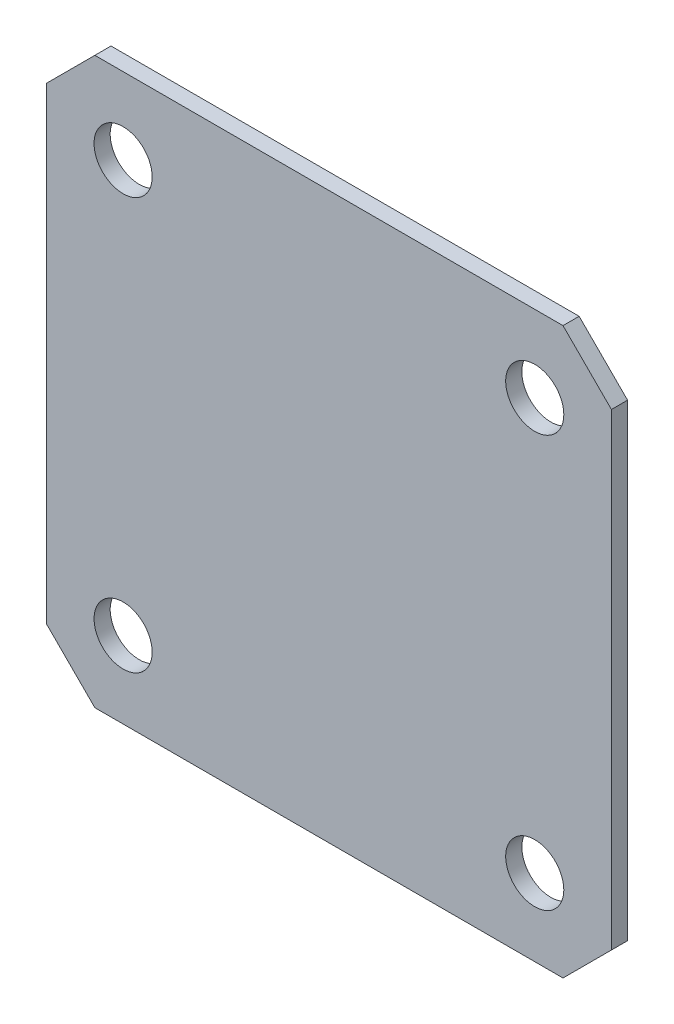
ISO-10303-21;
HEADER;
FILE_DESCRIPTION(('STEP AP214'),'2;1');
FILE_NAME('part.step','',(''),(''),'','','');
FILE_SCHEMA(('AUTOMOTIVE_DESIGN { 1 0 10303 214 1 1 1 1 }'));
ENDSEC;
DATA;
#1=APPLICATION_CONTEXT('core data for automotive mechanical design processes');
#2=APPLICATION_PROTOCOL_DEFINITION('international standard','automotive_design',2000,#1);
#3=PRODUCT_CONTEXT('',#1,'mechanical');
#4=PRODUCT('Part','Part','',(#3));
#5=PRODUCT_RELATED_PRODUCT_CATEGORY('part','',(#4));
#6=PRODUCT_DEFINITION_FORMATION('','',#4);
#7=PRODUCT_DEFINITION_CONTEXT('part definition',#1,'design');
#8=PRODUCT_DEFINITION('design','',#6,#7);
#9=PRODUCT_DEFINITION_SHAPE('','',#8);
#10=(LENGTH_UNIT() NAMED_UNIT(*) SI_UNIT(.MILLI.,.METRE.));
#11=(NAMED_UNIT(*) PLANE_ANGLE_UNIT() SI_UNIT($,.RADIAN.));
#12=(NAMED_UNIT(*) SI_UNIT($,.STERADIAN.) SOLID_ANGLE_UNIT());
#13=UNCERTAINTY_MEASURE_WITH_UNIT(LENGTH_MEASURE(1.E-05),#10,'distance_accuracy_value','');
#14=(GEOMETRIC_REPRESENTATION_CONTEXT(3) GLOBAL_UNCERTAINTY_ASSIGNED_CONTEXT((#13)) GLOBAL_UNIT_ASSIGNED_CONTEXT((#10,
#11,#12)) REPRESENTATION_CONTEXT('',''));
#15=CARTESIAN_POINT('',(0.,0.,0.));
#16=DIRECTION('',(0.,0.,1.));
#17=DIRECTION('',(1.,0.,0.));
#18=AXIS2_PLACEMENT_3D('',#15,#16,#17);
#19=CARTESIAN_POINT('',(0.,0.,1.));
#20=DIRECTION('',(0.,0.,1.));
#21=DIRECTION('',(1.,0.,0.));
#22=AXIS2_PLACEMENT_3D('',#19,#20,#21);
#23=PLANE('',#22);
#24=CARTESIAN_POINT('',(-12.75,-12.75,1.));
#25=DIRECTION('',(0.,0.,1.));
#26=DIRECTION('',(1.,0.,0.));
#27=AXIS2_PLACEMENT_3D('',#24,#25,#26);
#28=CIRCLE('',#27,1.8);
#29=CARTESIAN_POINT('',(-10.95,-12.75,1.));
#30=VERTEX_POINT('',#29);
#31=EDGE_CURVE('E188',#30,#30,#28,.T.);
#32=ORIENTED_EDGE('',*,*,#31,.F.);
#33=EDGE_LOOP('',(#32));
#34=FACE_BOUND('',#33,.T.);
#35=CARTESIAN_POINT('',(-12.75,12.75,1.));
#36=DIRECTION('',(0.,0.,1.));
#37=DIRECTION('',(1.,0.,0.));
#38=AXIS2_PLACEMENT_3D('',#35,#36,#37);
#39=CIRCLE('',#38,1.8);
#40=CARTESIAN_POINT('',(-10.95,12.75,1.));
#41=VERTEX_POINT('',#40);
#42=EDGE_CURVE('E129',#41,#41,#39,.T.);
#43=ORIENTED_EDGE('',*,*,#42,.F.);
#44=EDGE_LOOP('',(#43));
#45=FACE_BOUND('',#44,.T.);
#46=DIRECTION('',(-1.,0.,0.));
#47=VECTOR('',#46,1.);
#48=CARTESIAN_POINT('',(-17.5,17.5,1.));
#49=LINE('',#48,#47);
#50=CARTESIAN_POINT('',(14.5,17.5,1.));
#51=VERTEX_POINT('',#50);
#52=CARTESIAN_POINT('',(-14.5,17.5,1.));
#53=VERTEX_POINT('',#52);
#54=EDGE_CURVE('E138',#51,#53,#49,.T.);
#55=ORIENTED_EDGE('',*,*,#54,.T.);
#56=DIRECTION('',(0.707106781186548,0.707106781186547,0.));
#57=VECTOR('',#56,1.);
#58=CARTESIAN_POINT('',(-16.,16.,1.));
#59=LINE('',#58,#57);
#60=CARTESIAN_POINT('',(-17.5,14.5,1.));
#61=VERTEX_POINT('',#60);
#62=EDGE_CURVE('E157',#53,#61,#59,.F.);
#63=ORIENTED_EDGE('',*,*,#62,.T.);
#64=DIRECTION('',(0.,-1.,0.));
#65=VECTOR('',#64,1.);
#66=CARTESIAN_POINT('',(-17.5,17.5,1.));
#67=LINE('',#66,#65);
#68=CARTESIAN_POINT('',(-17.5,-14.5,1.));
#69=VERTEX_POINT('',#68);
#70=EDGE_CURVE('E121',#61,#69,#67,.T.);
#71=ORIENTED_EDGE('',*,*,#70,.T.);
#72=DIRECTION('',(-0.707106781186546,0.707106781186549,0.));
#73=VECTOR('',#72,1.);
#74=CARTESIAN_POINT('',(-16.,-16.,1.));
#75=LINE('',#74,#73);
#76=CARTESIAN_POINT('',(-14.5,-17.5,1.));
#77=VERTEX_POINT('',#76);
#78=EDGE_CURVE('E152',#69,#77,#75,.F.);
#79=ORIENTED_EDGE('',*,*,#78,.T.);
#80=DIRECTION('',(1.,0.,0.));
#81=VECTOR('',#80,1.);
#82=CARTESIAN_POINT('',(-17.5,-17.5,1.));
#83=LINE('',#82,#81);
#84=CARTESIAN_POINT('',(14.5,-17.5,1.));
#85=VERTEX_POINT('',#84);
#86=EDGE_CURVE('E168',#77,#85,#83,.T.);
#87=ORIENTED_EDGE('',*,*,#86,.T.);
#88=DIRECTION('',(-0.707106781186548,-0.707106781186547,0.));
#89=VECTOR('',#88,1.);
#90=CARTESIAN_POINT('',(16.,-16.,1.));
#91=LINE('',#90,#89);
#92=CARTESIAN_POINT('',(17.5,-14.5,1.));
#93=VERTEX_POINT('',#92);
#94=EDGE_CURVE('E57',#85,#93,#91,.F.);
#95=ORIENTED_EDGE('',*,*,#94,.T.);
#96=DIRECTION('',(0.,1.,0.));
#97=VECTOR('',#96,1.);
#98=CARTESIAN_POINT('',(17.5,17.5,1.));
#99=LINE('',#98,#97);
#100=CARTESIAN_POINT('',(17.5,14.5,1.));
#101=VERTEX_POINT('',#100);
#102=EDGE_CURVE('E176',#93,#101,#99,.T.);
#103=ORIENTED_EDGE('',*,*,#102,.T.);
#104=DIRECTION('',(0.707106781186547,-0.707106781186548,0.));
#105=VECTOR('',#104,1.);
#106=CARTESIAN_POINT('',(16.,16.,1.));
#107=LINE('',#106,#105);
#108=EDGE_CURVE('E155',#101,#51,#107,.F.);
#109=ORIENTED_EDGE('',*,*,#108,.T.);
#110=EDGE_LOOP('',(#55,#63,#71,#79,#87,#95,#103,#109));
#111=FACE_BOUND('',#110,.T.);
#112=CARTESIAN_POINT('',(12.75,12.75,1.));
#113=DIRECTION('',(0.,0.,1.));
#114=DIRECTION('',(1.,0.,0.));
#115=AXIS2_PLACEMENT_3D('',#112,#113,#114);
#116=CIRCLE('',#115,1.8);
#117=CARTESIAN_POINT('',(14.55,12.75,1.));
#118=VERTEX_POINT('',#117);
#119=EDGE_CURVE('E183',#118,#118,#116,.T.);
#120=ORIENTED_EDGE('',*,*,#119,.F.);
#121=EDGE_LOOP('',(#120));
#122=FACE_BOUND('',#121,.T.);
#123=CARTESIAN_POINT('',(12.75,-12.75,1.));
#124=DIRECTION('',(0.,0.,1.));
#125=DIRECTION('',(1.,0.,0.));
#126=AXIS2_PLACEMENT_3D('',#123,#124,#125);
#127=CIRCLE('',#126,1.8);
#128=CARTESIAN_POINT('',(14.55,-12.75,1.));
#129=VERTEX_POINT('',#128);
#130=EDGE_CURVE('E194',#129,#129,#127,.T.);
#131=ORIENTED_EDGE('',*,*,#130,.F.);
#132=EDGE_LOOP('',(#131));
#133=FACE_BOUND('',#132,.T.);
#134=ADVANCED_FACE('F35',(#34,#45,#111,#122,#133),#23,.T.);
#135=CARTESIAN_POINT('',(0.,0.,0.));
#136=DIRECTION('',(0.,0.,1.));
#137=DIRECTION('',(1.,0.,0.));
#138=AXIS2_PLACEMENT_3D('',#135,#136,#137);
#139=PLANE('',#138);
#140=DIRECTION('',(0.,-1.,0.));
#141=VECTOR('',#140,1.);
#142=CARTESIAN_POINT('',(-17.5,17.5,0.));
#143=LINE('',#142,#141);
#144=CARTESIAN_POINT('',(-17.5,14.5,0.));
#145=VERTEX_POINT('',#144);
#146=CARTESIAN_POINT('',(-17.5,-14.5,0.));
#147=VERTEX_POINT('',#146);
#148=EDGE_CURVE('E118',#145,#147,#143,.T.);
#149=ORIENTED_EDGE('',*,*,#148,.F.);
#150=DIRECTION('',(-0.707106781186548,-0.707106781186547,0.));
#151=VECTOR('',#150,1.);
#152=CARTESIAN_POINT('',(-17.5,14.5,0.));
#153=LINE('',#152,#151);
#154=CARTESIAN_POINT('',(-14.5,17.5,0.));
#155=VERTEX_POINT('',#154);
#156=EDGE_CURVE('E101',#145,#155,#153,.F.);
#157=ORIENTED_EDGE('',*,*,#156,.T.);
#158=DIRECTION('',(-1.,0.,0.));
#159=VECTOR('',#158,1.);
#160=CARTESIAN_POINT('',(-17.5,17.5,0.));
#161=LINE('',#160,#159);
#162=CARTESIAN_POINT('',(14.5,17.5,0.));
#163=VERTEX_POINT('',#162);
#164=EDGE_CURVE('E142',#163,#155,#161,.T.);
#165=ORIENTED_EDGE('',*,*,#164,.F.);
#166=DIRECTION('',(-0.707106781186547,0.707106781186548,0.));
#167=VECTOR('',#166,1.);
#168=CARTESIAN_POINT('',(14.5,17.5,0.));
#169=LINE('',#168,#167);
#170=CARTESIAN_POINT('',(17.5,14.5,0.));
#171=VERTEX_POINT('',#170);
#172=EDGE_CURVE('E112',#163,#171,#169,.F.);
#173=ORIENTED_EDGE('',*,*,#172,.T.);
#174=DIRECTION('',(0.,1.,0.));
#175=VECTOR('',#174,1.);
#176=CARTESIAN_POINT('',(17.5,17.5,0.));
#177=LINE('',#176,#175);
#178=CARTESIAN_POINT('',(17.5,-14.5,0.));
#179=VERTEX_POINT('',#178);
#180=EDGE_CURVE('E132',#179,#171,#177,.T.);
#181=ORIENTED_EDGE('',*,*,#180,.F.);
#182=DIRECTION('',(0.707106781186548,0.707106781186547,0.));
#183=VECTOR('',#182,1.);
#184=CARTESIAN_POINT('',(17.5,-14.5,0.));
#185=LINE('',#184,#183);
#186=CARTESIAN_POINT('',(14.5,-17.5,0.));
#187=VERTEX_POINT('',#186);
#188=EDGE_CURVE('E146',#179,#187,#185,.F.);
#189=ORIENTED_EDGE('',*,*,#188,.T.);
#190=DIRECTION('',(1.,0.,0.));
#191=VECTOR('',#190,1.);
#192=CARTESIAN_POINT('',(-17.5,-17.5,0.));
#193=LINE('',#192,#191);
#194=CARTESIAN_POINT('',(-14.5,-17.5,0.));
#195=VERTEX_POINT('',#194);
#196=EDGE_CURVE('E128',#195,#187,#193,.T.);
#197=ORIENTED_EDGE('',*,*,#196,.F.);
#198=DIRECTION('',(0.707106781186546,-0.707106781186549,0.));
#199=VECTOR('',#198,1.);
#200=CARTESIAN_POINT('',(-14.5,-17.5,0.));
#201=LINE('',#200,#199);
#202=EDGE_CURVE('E122',#195,#147,#201,.F.);
#203=ORIENTED_EDGE('',*,*,#202,.T.);
#204=EDGE_LOOP('',(#149,#157,#165,#173,#181,#189,#197,#203));
#205=FACE_BOUND('',#204,.T.);
#206=CARTESIAN_POINT('',(-12.75,12.75,0.));
#207=DIRECTION('',(0.,0.,1.));
#208=DIRECTION('',(1.,0.,0.));
#209=AXIS2_PLACEMENT_3D('',#206,#207,#208);
#210=CIRCLE('',#209,1.8);
#211=CARTESIAN_POINT('',(-10.95,12.75,0.));
#212=VERTEX_POINT('',#211);
#213=EDGE_CURVE('E135',#212,#212,#210,.T.);
#214=ORIENTED_EDGE('',*,*,#213,.T.);
#215=EDGE_LOOP('',(#214));
#216=FACE_BOUND('',#215,.T.);
#217=CARTESIAN_POINT('',(12.75,12.75,0.));
#218=DIRECTION('',(0.,0.,1.));
#219=DIRECTION('',(1.,0.,0.));
#220=AXIS2_PLACEMENT_3D('',#217,#218,#219);
#221=CIRCLE('',#220,1.8);
#222=CARTESIAN_POINT('',(14.55,12.75,0.));
#223=VERTEX_POINT('',#222);
#224=EDGE_CURVE('E185',#223,#223,#221,.T.);
#225=ORIENTED_EDGE('',*,*,#224,.T.);
#226=EDGE_LOOP('',(#225));
#227=FACE_BOUND('',#226,.T.);
#228=CARTESIAN_POINT('',(-12.75,-12.75,0.));
#229=DIRECTION('',(0.,0.,1.));
#230=DIRECTION('',(1.,0.,0.));
#231=AXIS2_PLACEMENT_3D('',#228,#229,#230);
#232=CIRCLE('',#231,1.8);
#233=CARTESIAN_POINT('',(-10.95,-12.75,0.));
#234=VERTEX_POINT('',#233);
#235=EDGE_CURVE('E191',#234,#234,#232,.T.);
#236=ORIENTED_EDGE('',*,*,#235,.T.);
#237=EDGE_LOOP('',(#236));
#238=FACE_BOUND('',#237,.T.);
#239=CARTESIAN_POINT('',(12.75,-12.75,0.));
#240=DIRECTION('',(0.,0.,1.));
#241=DIRECTION('',(1.,0.,0.));
#242=AXIS2_PLACEMENT_3D('',#239,#240,#241);
#243=CIRCLE('',#242,1.8);
#244=CARTESIAN_POINT('',(14.55,-12.75,0.));
#245=VERTEX_POINT('',#244);
#246=EDGE_CURVE('E197',#245,#245,#243,.T.);
#247=ORIENTED_EDGE('',*,*,#246,.T.);
#248=EDGE_LOOP('',(#247));
#249=FACE_BOUND('',#248,.T.);
#250=ADVANCED_FACE('F125',(#205,#216,#227,#238,#249),#139,.F.);
#251=CARTESIAN_POINT('',(-17.5,17.5,1.));
#252=DIRECTION('',(1.,0.,0.));
#253=DIRECTION('',(0.,1.,0.));
#254=AXIS2_PLACEMENT_3D('',#251,#252,#253);
#255=PLANE('',#254);
#256=ORIENTED_EDGE('',*,*,#70,.F.);
#257=DIRECTION('',(0.,0.,-1.));
#258=VECTOR('',#257,1.);
#259=CARTESIAN_POINT('',(-17.5,14.5,1.));
#260=LINE('',#259,#258);
#261=EDGE_CURVE('E105',#61,#145,#260,.T.);
#262=ORIENTED_EDGE('',*,*,#261,.T.);
#263=ORIENTED_EDGE('',*,*,#148,.T.);
#264=DIRECTION('',(0.,0.,1.));
#265=VECTOR('',#264,1.);
#266=CARTESIAN_POINT('',(-17.5,-14.5,1.));
#267=LINE('',#266,#265);
#268=EDGE_CURVE('E123',#147,#69,#267,.T.);
#269=ORIENTED_EDGE('',*,*,#268,.T.);
#270=EDGE_LOOP('',(#256,#262,#263,#269));
#271=FACE_BOUND('',#270,.T.);
#272=ADVANCED_FACE('F117',(#271),#255,.F.);
#273=CARTESIAN_POINT('',(-17.5,-17.5,1.));
#274=DIRECTION('',(0.,1.,0.));
#275=DIRECTION('',(0.,0.,1.));
#276=AXIS2_PLACEMENT_3D('',#273,#274,#275);
#277=PLANE('',#276);
#278=ORIENTED_EDGE('',*,*,#196,.T.);
#279=DIRECTION('',(0.,0.,1.));
#280=VECTOR('',#279,1.);
#281=CARTESIAN_POINT('',(14.5,-17.5,1.));
#282=LINE('',#281,#280);
#283=EDGE_CURVE('E11',#187,#85,#282,.T.);
#284=ORIENTED_EDGE('',*,*,#283,.T.);
#285=ORIENTED_EDGE('',*,*,#86,.F.);
#286=DIRECTION('',(0.,0.,-1.));
#287=VECTOR('',#286,1.);
#288=CARTESIAN_POINT('',(-14.5,-17.5,1.));
#289=LINE('',#288,#287);
#290=EDGE_CURVE('E43',#77,#195,#289,.T.);
#291=ORIENTED_EDGE('',*,*,#290,.T.);
#292=EDGE_LOOP('',(#278,#284,#285,#291));
#293=FACE_BOUND('',#292,.T.);
#294=ADVANCED_FACE('F166',(#293),#277,.F.);
#295=CARTESIAN_POINT('',(17.5,17.5,1.));
#296=DIRECTION('',(-1.,0.,0.));
#297=DIRECTION('',(0.,0.,1.));
#298=AXIS2_PLACEMENT_3D('',#295,#296,#297);
#299=PLANE('',#298);
#300=ORIENTED_EDGE('',*,*,#180,.T.);
#301=DIRECTION('',(0.,0.,1.));
#302=VECTOR('',#301,1.);
#303=CARTESIAN_POINT('',(17.5,14.5,1.));
#304=LINE('',#303,#302);
#305=EDGE_CURVE('E50',#171,#101,#304,.T.);
#306=ORIENTED_EDGE('',*,*,#305,.T.);
#307=ORIENTED_EDGE('',*,*,#102,.F.);
#308=DIRECTION('',(0.,0.,-1.));
#309=VECTOR('',#308,1.);
#310=CARTESIAN_POINT('',(17.5,-14.5,1.));
#311=LINE('',#310,#309);
#312=EDGE_CURVE('E159',#93,#179,#311,.T.);
#313=ORIENTED_EDGE('',*,*,#312,.T.);
#314=EDGE_LOOP('',(#300,#306,#307,#313));
#315=FACE_BOUND('',#314,.T.);
#316=ADVANCED_FACE('F175',(#315),#299,.F.);
#317=CARTESIAN_POINT('',(-17.5,17.5,1.));
#318=DIRECTION('',(0.,-1.,0.));
#319=DIRECTION('',(0.,0.,-1.));
#320=AXIS2_PLACEMENT_3D('',#317,#318,#319);
#321=PLANE('',#320);
#322=ORIENTED_EDGE('',*,*,#164,.T.);
#323=DIRECTION('',(0.,0.,1.));
#324=VECTOR('',#323,1.);
#325=CARTESIAN_POINT('',(-14.5,17.5,1.));
#326=LINE('',#325,#324);
#327=EDGE_CURVE('E106',#155,#53,#326,.T.);
#328=ORIENTED_EDGE('',*,*,#327,.T.);
#329=ORIENTED_EDGE('',*,*,#54,.F.);
#330=DIRECTION('',(0.,0.,-1.));
#331=VECTOR('',#330,1.);
#332=CARTESIAN_POINT('',(14.5,17.5,1.));
#333=LINE('',#332,#331);
#334=EDGE_CURVE('E111',#51,#163,#333,.T.);
#335=ORIENTED_EDGE('',*,*,#334,.T.);
#336=EDGE_LOOP('',(#322,#328,#329,#335));
#337=FACE_BOUND('',#336,.T.);
#338=ADVANCED_FACE('F219',(#337),#321,.F.);
#339=CARTESIAN_POINT('',(-12.75,12.75,1.));
#340=DIRECTION('',(0.,0.,-1.));
#341=DIRECTION('',(-1.,0.,0.));
#342=AXIS2_PLACEMENT_3D('',#339,#340,#341);
#343=CYLINDRICAL_SURFACE('',#342,1.8);
#344=ORIENTED_EDGE('',*,*,#42,.T.);
#345=EDGE_LOOP('',(#344));
#346=FACE_BOUND('',#345,.T.);
#347=ORIENTED_EDGE('',*,*,#213,.F.);
#348=EDGE_LOOP('',(#347));
#349=FACE_BOUND('',#348,.T.);
#350=ADVANCED_FACE('F216',(#346,#349),#343,.F.);
#351=CARTESIAN_POINT('',(12.75,12.75,1.));
#352=DIRECTION('',(0.,0.,-1.));
#353=DIRECTION('',(-1.,0.,0.));
#354=AXIS2_PLACEMENT_3D('',#351,#352,#353);
#355=CYLINDRICAL_SURFACE('',#354,1.8);
#356=ORIENTED_EDGE('',*,*,#119,.T.);
#357=EDGE_LOOP('',(#356));
#358=FACE_BOUND('',#357,.T.);
#359=ORIENTED_EDGE('',*,*,#224,.F.);
#360=EDGE_LOOP('',(#359));
#361=FACE_BOUND('',#360,.T.);
#362=ADVANCED_FACE('F245',(#358,#361),#355,.F.);
#363=CARTESIAN_POINT('',(-12.75,-12.75,1.));
#364=DIRECTION('',(0.,0.,-1.));
#365=DIRECTION('',(-1.,0.,0.));
#366=AXIS2_PLACEMENT_3D('',#363,#364,#365);
#367=CYLINDRICAL_SURFACE('',#366,1.8);
#368=ORIENTED_EDGE('',*,*,#31,.T.);
#369=EDGE_LOOP('',(#368));
#370=FACE_BOUND('',#369,.T.);
#371=ORIENTED_EDGE('',*,*,#235,.F.);
#372=EDGE_LOOP('',(#371));
#373=FACE_BOUND('',#372,.T.);
#374=ADVANCED_FACE('F248',(#370,#373),#367,.F.);
#375=CARTESIAN_POINT('',(12.75,-12.75,1.));
#376=DIRECTION('',(0.,0.,-1.));
#377=DIRECTION('',(-1.,0.,0.));
#378=AXIS2_PLACEMENT_3D('',#375,#376,#377);
#379=CYLINDRICAL_SURFACE('',#378,1.8);
#380=ORIENTED_EDGE('',*,*,#130,.T.);
#381=EDGE_LOOP('',(#380));
#382=FACE_BOUND('',#381,.T.);
#383=ORIENTED_EDGE('',*,*,#246,.F.);
#384=EDGE_LOOP('',(#383));
#385=FACE_BOUND('',#384,.T.);
#386=ADVANCED_FACE('F203',(#382,#385),#379,.F.);
#387=CARTESIAN_POINT('',(-17.5,14.5,1.));
#388=DIRECTION('',(0.707106781186547,-0.707106781186548,0.));
#389=DIRECTION('',(0.,0.,-1.));
#390=AXIS2_PLACEMENT_3D('',#387,#388,#389);
#391=PLANE('',#390);
#392=ORIENTED_EDGE('',*,*,#62,.F.);
#393=ORIENTED_EDGE('',*,*,#327,.F.);
#394=ORIENTED_EDGE('',*,*,#156,.F.);
#395=ORIENTED_EDGE('',*,*,#261,.F.);
#396=EDGE_LOOP('',(#392,#393,#394,#395));
#397=FACE_BOUND('',#396,.T.);
#398=ADVANCED_FACE('F104',(#397),#391,.F.);
#399=CARTESIAN_POINT('',(14.5,17.5,1.));
#400=DIRECTION('',(-0.707106781186548,-0.707106781186547,0.));
#401=DIRECTION('',(0.,0.,-1.));
#402=AXIS2_PLACEMENT_3D('',#399,#400,#401);
#403=PLANE('',#402);
#404=ORIENTED_EDGE('',*,*,#108,.F.);
#405=ORIENTED_EDGE('',*,*,#305,.F.);
#406=ORIENTED_EDGE('',*,*,#172,.F.);
#407=ORIENTED_EDGE('',*,*,#334,.F.);
#408=EDGE_LOOP('',(#404,#405,#406,#407));
#409=FACE_BOUND('',#408,.T.);
#410=ADVANCED_FACE('F231',(#409),#403,.F.);
#411=CARTESIAN_POINT('',(17.5,-14.5,1.));
#412=DIRECTION('',(-0.707106781186547,0.707106781186548,0.));
#413=DIRECTION('',(0.,0.,-1.));
#414=AXIS2_PLACEMENT_3D('',#411,#412,#413);
#415=PLANE('',#414);
#416=ORIENTED_EDGE('',*,*,#94,.F.);
#417=ORIENTED_EDGE('',*,*,#283,.F.);
#418=ORIENTED_EDGE('',*,*,#188,.F.);
#419=ORIENTED_EDGE('',*,*,#312,.F.);
#420=EDGE_LOOP('',(#416,#417,#418,#419));
#421=FACE_BOUND('',#420,.T.);
#422=ADVANCED_FACE('F174',(#421),#415,.F.);
#423=CARTESIAN_POINT('',(-14.5,-17.5,1.));
#424=DIRECTION('',(0.707106781186549,0.707106781186546,0.));
#425=DIRECTION('',(0.,0.,-1.));
#426=AXIS2_PLACEMENT_3D('',#423,#424,#425);
#427=PLANE('',#426);
#428=ORIENTED_EDGE('',*,*,#78,.F.);
#429=ORIENTED_EDGE('',*,*,#268,.F.);
#430=ORIENTED_EDGE('',*,*,#202,.F.);
#431=ORIENTED_EDGE('',*,*,#290,.F.);
#432=EDGE_LOOP('',(#428,#429,#430,#431));
#433=FACE_BOUND('',#432,.T.);
#434=ADVANCED_FACE('F37',(#433),#427,.F.);
#435=CLOSED_SHELL('',(#134,#250,#272,#294,#316,#338,#350,#362,#374,#386,#398,#410,#422,#434));
#436=MANIFOLD_SOLID_BREP('B2',#435);
#437=ADVANCED_BREP_SHAPE_REPRESENTATION('',(#18,#436),#14);
#438=SHAPE_DEFINITION_REPRESENTATION(#9,#437);
ENDSEC;
END-ISO-10303-21;
